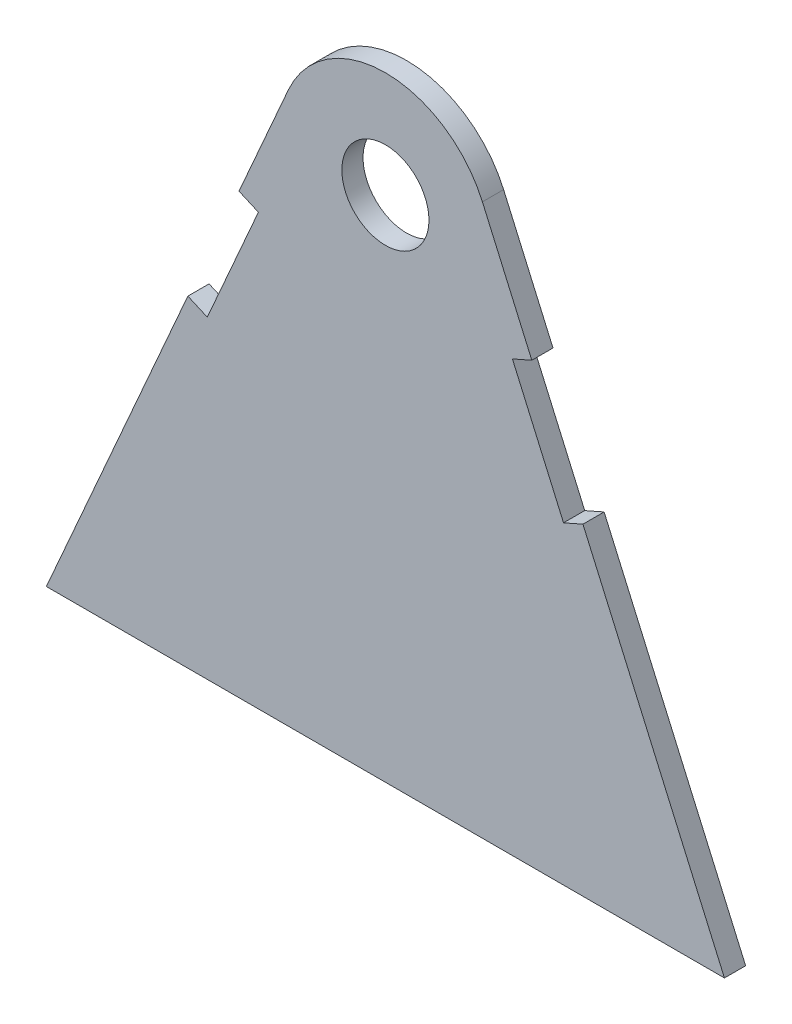
ISO-10303-21;
HEADER;
FILE_DESCRIPTION(('STEP AP214'),'2;1');
FILE_NAME('part.step','',(''),(''),'','','');
FILE_SCHEMA(('AUTOMOTIVE_DESIGN { 1 0 10303 214 1 1 1 1 }'));
ENDSEC;
DATA;
#1=APPLICATION_CONTEXT('core data for automotive mechanical design processes');
#2=APPLICATION_PROTOCOL_DEFINITION('international standard','automotive_design',2000,#1);
#3=PRODUCT_CONTEXT('',#1,'mechanical');
#4=PRODUCT('Part','Part','',(#3));
#5=PRODUCT_RELATED_PRODUCT_CATEGORY('part','',(#4));
#6=PRODUCT_DEFINITION_FORMATION('','',#4);
#7=PRODUCT_DEFINITION_CONTEXT('part definition',#1,'design');
#8=PRODUCT_DEFINITION('design','',#6,#7);
#9=PRODUCT_DEFINITION_SHAPE('','',#8);
#10=(LENGTH_UNIT() NAMED_UNIT(*) SI_UNIT(.MILLI.,.METRE.));
#11=(NAMED_UNIT(*) PLANE_ANGLE_UNIT() SI_UNIT($,.RADIAN.));
#12=(NAMED_UNIT(*) SI_UNIT($,.STERADIAN.) SOLID_ANGLE_UNIT());
#13=UNCERTAINTY_MEASURE_WITH_UNIT(LENGTH_MEASURE(1.E-05),#10,'distance_accuracy_value','');
#14=(GEOMETRIC_REPRESENTATION_CONTEXT(3) GLOBAL_UNCERTAINTY_ASSIGNED_CONTEXT((#13)) GLOBAL_UNIT_ASSIGNED_CONTEXT((#10,
#11,#12)) REPRESENTATION_CONTEXT('',''));
#15=CARTESIAN_POINT('',(0.,0.,0.));
#16=DIRECTION('',(0.,0.,1.));
#17=DIRECTION('',(1.,0.,0.));
#18=AXIS2_PLACEMENT_3D('',#15,#16,#17);
#19=CARTESIAN_POINT('',(0.,0.,1.5875));
#20=DIRECTION('',(0.,0.,-1.));
#21=DIRECTION('',(-1.,0.,0.));
#22=AXIS2_PLACEMENT_3D('',#19,#20,#21);
#23=CYLINDRICAL_SURFACE('',#22,7.9375);
#24=CARTESIAN_POINT('',(0.,0.,0.));
#25=DIRECTION('',(0.,0.,1.));
#26=DIRECTION('',(1.,0.,0.));
#27=AXIS2_PLACEMENT_3D('',#24,#25,#26);
#28=CIRCLE('',#27,7.9375);
#29=CARTESIAN_POINT('',(-7.26763882574666,3.19144671716444,0.));
#30=VERTEX_POINT('',#29);
#31=CARTESIAN_POINT('',(7.26763882574666,3.19144671716444,0.));
#32=VERTEX_POINT('',#31);
#33=EDGE_CURVE('E155',#30,#32,#28,.F.);
#34=ORIENTED_EDGE('',*,*,#33,.F.);
#35=DIRECTION('',(0.,0.,-1.));
#36=VECTOR('',#35,1.);
#37=CARTESIAN_POINT('',(-7.26763882574666,3.19144671716444,1.5875));
#38=LINE('',#37,#36);
#39=CARTESIAN_POINT('',(-7.26763882574666,3.19144671716444,1.5875));
#40=VERTEX_POINT('',#39);
#41=EDGE_CURVE('E11',#40,#30,#38,.T.);
#42=ORIENTED_EDGE('',*,*,#41,.F.);
#43=CARTESIAN_POINT('',(0.,0.,1.5875));
#44=DIRECTION('',(0.,0.,1.));
#45=DIRECTION('',(1.,0.,0.));
#46=AXIS2_PLACEMENT_3D('',#43,#44,#45);
#47=CIRCLE('',#46,7.9375);
#48=CARTESIAN_POINT('',(7.26763882574666,3.19144671716444,1.5875));
#49=VERTEX_POINT('',#48);
#50=EDGE_CURVE('E238',#40,#49,#47,.F.);
#51=ORIENTED_EDGE('',*,*,#50,.T.);
#52=DIRECTION('',(0.,0.,-1.));
#53=VECTOR('',#52,1.);
#54=CARTESIAN_POINT('',(7.26763882574666,3.19144671716444,1.5875));
#55=LINE('',#54,#53);
#56=EDGE_CURVE('E99',#49,#32,#55,.T.);
#57=ORIENTED_EDGE('',*,*,#56,.T.);
#58=EDGE_LOOP('',(#34,#42,#51,#57));
#59=FACE_BOUND('',#58,.T.);
#60=ADVANCED_FACE('F37',(#59),#23,.T.);
#61=CARTESIAN_POINT('',(-7.26763882574666,3.19144671716444,1.5875));
#62=DIRECTION('',(0.915608041038949,-0.4020720273593,0.));
#63=DIRECTION('',(0.4020720273593,0.91560804103895,0.));
#64=AXIS2_PLACEMENT_3D('',#61,#62,#63);
#65=PLANE('',#64);
#66=DIRECTION('',(-0.4020720273593,-0.91560804103895,0.));
#67=VECTOR('',#66,1.);
#68=CARTESIAN_POINT('',(-7.26763882574666,3.19144671716444,0.));
#69=LINE('',#68,#67);
#70=CARTESIAN_POINT('',(-10.9684254719667,-5.23607318195205,0.));
#71=VERTEX_POINT('',#70);
#72=EDGE_CURVE('E158',#30,#71,#69,.T.);
#73=ORIENTED_EDGE('',*,*,#72,.T.);
#74=DIRECTION('',(0.,0.,-1.));
#75=VECTOR('',#74,1.);
#76=CARTESIAN_POINT('',(-10.9684254719667,-5.23607318195205,1.5875));
#77=LINE('',#76,#75);
#78=CARTESIAN_POINT('',(-10.9684254719667,-5.23607318195205,1.5875));
#79=VERTEX_POINT('',#78);
#80=EDGE_CURVE('E45',#79,#71,#77,.T.);
#81=ORIENTED_EDGE('',*,*,#80,.F.);
#82=DIRECTION('',(-0.4020720273593,-0.91560804103895,0.));
#83=VECTOR('',#82,1.);
#84=CARTESIAN_POINT('',(-7.26763882574666,3.19144671716444,1.5875));
#85=LINE('',#84,#83);
#86=EDGE_CURVE('E239',#40,#79,#85,.T.);
#87=ORIENTED_EDGE('',*,*,#86,.F.);
#88=ORIENTED_EDGE('',*,*,#41,.T.);
#89=EDGE_LOOP('',(#73,#81,#87,#88));
#90=FACE_BOUND('',#89,.T.);
#91=ADVANCED_FACE('F244',(#90),#65,.F.);
#92=CARTESIAN_POINT('',(-3.70078664622001,-8.42751989911649,1.5875));
#93=DIRECTION('',(0.4020720273593,0.915608041038949,0.));
#94=DIRECTION('',(-0.915608041038949,0.4020720273593,0.));
#95=AXIS2_PLACEMENT_3D('',#92,#93,#94);
#96=PLANE('',#95);
#97=DIRECTION('',(0.915608041038949,-0.4020720273593,0.));
#98=VECTOR('',#97,1.);
#99=CARTESIAN_POINT('',(-3.70078664622001,-8.42751989911649,0.));
#100=LINE('',#99,#98);
#101=CARTESIAN_POINT('',(-9.51489770681733,-5.87436252538494,0.));
#102=VERTEX_POINT('',#101);
#103=EDGE_CURVE('E161',#71,#102,#100,.T.);
#104=ORIENTED_EDGE('',*,*,#103,.T.);
#105=DIRECTION('',(0.,0.,-1.));
#106=VECTOR('',#105,1.);
#107=CARTESIAN_POINT('',(-9.51489770681733,-5.87436252538494,1.5875));
#108=LINE('',#107,#106);
#109=CARTESIAN_POINT('',(-9.51489770681733,-5.87436252538494,1.5875));
#110=VERTEX_POINT('',#109);
#111=EDGE_CURVE('E198',#110,#102,#108,.T.);
#112=ORIENTED_EDGE('',*,*,#111,.F.);
#113=DIRECTION('',(0.915608041038949,-0.4020720273593,0.));
#114=VECTOR('',#113,1.);
#115=CARTESIAN_POINT('',(-3.70078664622001,-8.42751989911649,1.5875));
#116=LINE('',#115,#114);
#117=EDGE_CURVE('E207',#79,#110,#116,.T.);
#118=ORIENTED_EDGE('',*,*,#117,.F.);
#119=ORIENTED_EDGE('',*,*,#80,.T.);
#120=EDGE_LOOP('',(#104,#112,#118,#119));
#121=FACE_BOUND('',#120,.T.);
#122=ADVANCED_FACE('F205',(#121),#96,.F.);
#123=CARTESIAN_POINT('',(-5.81411106059732,2.55315737373155,1.5875));
#124=DIRECTION('',(0.91560804103895,-0.402072027359299,0.));
#125=DIRECTION('',(0.402072027359299,0.91560804103895,0.));
#126=AXIS2_PLACEMENT_3D('',#123,#124,#125);
#127=PLANE('',#126);
#128=DIRECTION('',(-0.402072027359299,-0.91560804103895,0.));
#129=VECTOR('',#128,1.);
#130=CARTESIAN_POINT('',(-5.81411106059732,2.55315737373155,0.));
#131=LINE('',#130,#129);
#132=CARTESIAN_POINT('',(-13.3446337674147,-14.5955291162809,0.));
#133=VERTEX_POINT('',#132);
#134=EDGE_CURVE('E163',#102,#133,#131,.T.);
#135=ORIENTED_EDGE('',*,*,#134,.T.);
#136=DIRECTION('',(0.,0.,-1.));
#137=VECTOR('',#136,1.);
#138=CARTESIAN_POINT('',(-13.3446337674147,-14.5955291162809,1.5875));
#139=LINE('',#138,#137);
#140=CARTESIAN_POINT('',(-13.3446337674147,-14.5955291162809,1.5875));
#141=VERTEX_POINT('',#140);
#142=EDGE_CURVE('E195',#141,#133,#139,.T.);
#143=ORIENTED_EDGE('',*,*,#142,.F.);
#144=DIRECTION('',(-0.402072027359299,-0.91560804103895,0.));
#145=VECTOR('',#144,1.);
#146=CARTESIAN_POINT('',(-5.81411106059732,2.55315737373155,1.5875));
#147=LINE('',#146,#145);
#148=EDGE_CURVE('E226',#110,#141,#147,.T.);
#149=ORIENTED_EDGE('',*,*,#148,.F.);
#150=ORIENTED_EDGE('',*,*,#111,.T.);
#151=EDGE_LOOP('',(#135,#143,#149,#150));
#152=FACE_BOUND('',#151,.T.);
#153=ADVANCED_FACE('F217',(#152),#127,.F.);
#154=CARTESIAN_POINT('',(-7.53052270681734,-17.1486864900125,1.5875));
#155=DIRECTION('',(-0.4020720273593,-0.915608041038949,0.));
#156=DIRECTION('',(0.91560804103895,-0.4020720273593,0.));
#157=AXIS2_PLACEMENT_3D('',#154,#155,#156);
#158=PLANE('',#157);
#159=DIRECTION('',(-0.91560804103895,0.4020720273593,0.));
#160=VECTOR('',#159,1.);
#161=CARTESIAN_POINT('',(-7.53052270681734,-17.1486864900125,0.));
#162=LINE('',#161,#160);
#163=CARTESIAN_POINT('',(-14.798161532564,-13.957239772848,0.));
#164=VERTEX_POINT('',#163);
#165=EDGE_CURVE('E165',#133,#164,#162,.T.);
#166=ORIENTED_EDGE('',*,*,#165,.T.);
#167=DIRECTION('',(0.,0.,-1.));
#168=VECTOR('',#167,1.);
#169=CARTESIAN_POINT('',(-14.798161532564,-13.957239772848,1.5875));
#170=LINE('',#169,#168);
#171=CARTESIAN_POINT('',(-14.798161532564,-13.957239772848,1.5875));
#172=VERTEX_POINT('',#171);
#173=EDGE_CURVE('E192',#172,#164,#170,.T.);
#174=ORIENTED_EDGE('',*,*,#173,.F.);
#175=DIRECTION('',(-0.91560804103895,0.4020720273593,0.));
#176=VECTOR('',#175,1.);
#177=CARTESIAN_POINT('',(-7.53052270681734,-17.1486864900125,1.5875));
#178=LINE('',#177,#176);
#179=EDGE_CURVE('E223',#141,#172,#178,.T.);
#180=ORIENTED_EDGE('',*,*,#179,.F.);
#181=ORIENTED_EDGE('',*,*,#142,.T.);
#182=EDGE_LOOP('',(#166,#174,#180,#181));
#183=FACE_BOUND('',#182,.T.);
#184=ADVANCED_FACE('F221',(#183),#158,.F.);
#185=CARTESIAN_POINT('',(-7.26763882574666,3.19144671716444,1.5875));
#186=DIRECTION('',(0.915608041038949,-0.4020720273593,0.));
#187=DIRECTION('',(0.4020720273593,0.91560804103895,0.));
#188=AXIS2_PLACEMENT_3D('',#185,#186,#187);
#189=PLANE('',#188);
#190=DIRECTION('',(-0.4020720273593,-0.91560804103895,0.));
#191=VECTOR('',#190,1.);
#192=CARTESIAN_POINT('',(-7.26763882574666,3.19144671716444,0.));
#193=LINE('',#192,#191);
#194=CARTESIAN_POINT('',(-25.4,-38.1,0.));
#195=VERTEX_POINT('',#194);
#196=EDGE_CURVE('E167',#164,#195,#193,.T.);
#197=ORIENTED_EDGE('',*,*,#196,.T.);
#198=DIRECTION('',(0.,0.,-1.));
#199=VECTOR('',#198,1.);
#200=CARTESIAN_POINT('',(-25.4,-38.1,1.5875));
#201=LINE('',#200,#199);
#202=CARTESIAN_POINT('',(-25.4,-38.1,1.5875));
#203=VERTEX_POINT('',#202);
#204=EDGE_CURVE('E189',#203,#195,#201,.T.);
#205=ORIENTED_EDGE('',*,*,#204,.F.);
#206=DIRECTION('',(-0.4020720273593,-0.91560804103895,0.));
#207=VECTOR('',#206,1.);
#208=CARTESIAN_POINT('',(-7.26763882574666,3.19144671716444,1.5875));
#209=LINE('',#208,#207);
#210=EDGE_CURVE('E225',#172,#203,#209,.T.);
#211=ORIENTED_EDGE('',*,*,#210,.F.);
#212=ORIENTED_EDGE('',*,*,#173,.T.);
#213=EDGE_LOOP('',(#197,#205,#211,#212));
#214=FACE_BOUND('',#213,.T.);
#215=ADVANCED_FACE('F256',(#214),#189,.F.);
#216=CARTESIAN_POINT('',(0.,-38.1,1.5875));
#217=DIRECTION('',(0.,1.,0.));
#218=DIRECTION('',(0.,0.,1.));
#219=AXIS2_PLACEMENT_3D('',#216,#217,#218);
#220=PLANE('',#219);
#221=DIRECTION('',(1.,0.,0.));
#222=VECTOR('',#221,1.);
#223=CARTESIAN_POINT('',(0.,-38.1,0.));
#224=LINE('',#223,#222);
#225=CARTESIAN_POINT('',(25.4,-38.1,0.));
#226=VERTEX_POINT('',#225);
#227=EDGE_CURVE('E169',#195,#226,#224,.T.);
#228=ORIENTED_EDGE('',*,*,#227,.T.);
#229=DIRECTION('',(0.,0.,-1.));
#230=VECTOR('',#229,1.);
#231=CARTESIAN_POINT('',(25.4,-38.1,1.5875));
#232=LINE('',#231,#230);
#233=CARTESIAN_POINT('',(25.4,-38.1,1.5875));
#234=VERTEX_POINT('',#233);
#235=EDGE_CURVE('E186',#234,#226,#232,.T.);
#236=ORIENTED_EDGE('',*,*,#235,.F.);
#237=DIRECTION('',(1.,0.,0.));
#238=VECTOR('',#237,1.);
#239=CARTESIAN_POINT('',(0.,-38.1,1.5875));
#240=LINE('',#239,#238);
#241=EDGE_CURVE('E228',#203,#234,#240,.T.);
#242=ORIENTED_EDGE('',*,*,#241,.F.);
#243=ORIENTED_EDGE('',*,*,#204,.T.);
#244=EDGE_LOOP('',(#228,#236,#242,#243));
#245=FACE_BOUND('',#244,.T.);
#246=ADVANCED_FACE('F259',(#245),#220,.F.);
#247=CARTESIAN_POINT('',(7.26763882574666,3.19144671716444,1.5875));
#248=DIRECTION('',(-0.915608041038949,-0.4020720273593,0.));
#249=DIRECTION('',(0.4020720273593,-0.91560804103895,0.));
#250=AXIS2_PLACEMENT_3D('',#247,#248,#249);
#251=PLANE('',#250);
#252=DIRECTION('',(-0.4020720273593,0.91560804103895,0.));
#253=VECTOR('',#252,1.);
#254=CARTESIAN_POINT('',(7.26763882574666,3.19144671716444,0.));
#255=LINE('',#254,#253);
#256=CARTESIAN_POINT('',(14.798161532564,-13.957239772848,0.));
#257=VERTEX_POINT('',#256);
#258=EDGE_CURVE('E171',#226,#257,#255,.T.);
#259=ORIENTED_EDGE('',*,*,#258,.T.);
#260=DIRECTION('',(0.,0.,-1.));
#261=VECTOR('',#260,1.);
#262=CARTESIAN_POINT('',(14.798161532564,-13.957239772848,1.5875));
#263=LINE('',#262,#261);
#264=CARTESIAN_POINT('',(14.798161532564,-13.957239772848,1.5875));
#265=VERTEX_POINT('',#264);
#266=EDGE_CURVE('E184',#265,#257,#263,.T.);
#267=ORIENTED_EDGE('',*,*,#266,.F.);
#268=DIRECTION('',(-0.4020720273593,0.91560804103895,0.));
#269=VECTOR('',#268,1.);
#270=CARTESIAN_POINT('',(7.26763882574666,3.19144671716444,1.5875));
#271=LINE('',#270,#269);
#272=EDGE_CURVE('E152',#234,#265,#271,.T.);
#273=ORIENTED_EDGE('',*,*,#272,.F.);
#274=ORIENTED_EDGE('',*,*,#235,.T.);
#275=EDGE_LOOP('',(#259,#267,#273,#274));
#276=FACE_BOUND('',#275,.T.);
#277=ADVANCED_FACE('F263',(#276),#251,.F.);
#278=CARTESIAN_POINT('',(7.5305227068173,-17.1486864900125,1.5875));
#279=DIRECTION('',(-0.402072027359298,0.91560804103895,0.));
#280=DIRECTION('',(-0.91560804103895,-0.402072027359298,0.));
#281=AXIS2_PLACEMENT_3D('',#278,#279,#280);
#282=PLANE('',#281);
#283=DIRECTION('',(0.91560804103895,0.402072027359298,0.));
#284=VECTOR('',#283,1.);
#285=CARTESIAN_POINT('',(7.5305227068173,-17.1486864900125,0.));
#286=LINE('',#285,#284);
#287=CARTESIAN_POINT('',(13.3446337674147,-14.5955291162809,0.));
#288=VERTEX_POINT('',#287);
#289=EDGE_CURVE('E174',#288,#257,#286,.T.);
#290=ORIENTED_EDGE('',*,*,#289,.F.);
#291=DIRECTION('',(0.,0.,-1.));
#292=VECTOR('',#291,1.);
#293=CARTESIAN_POINT('',(13.3446337674147,-14.5955291162809,1.5875));
#294=LINE('',#293,#292);
#295=CARTESIAN_POINT('',(13.3446337674147,-14.5955291162809,1.5875));
#296=VERTEX_POINT('',#295);
#297=EDGE_CURVE('E141',#296,#288,#294,.T.);
#298=ORIENTED_EDGE('',*,*,#297,.F.);
#299=DIRECTION('',(0.91560804103895,0.402072027359298,0.));
#300=VECTOR('',#299,1.);
#301=CARTESIAN_POINT('',(7.5305227068173,-17.1486864900125,1.5875));
#302=LINE('',#301,#300);
#303=EDGE_CURVE('E147',#296,#265,#302,.T.);
#304=ORIENTED_EDGE('',*,*,#303,.T.);
#305=ORIENTED_EDGE('',*,*,#266,.T.);
#306=EDGE_LOOP('',(#290,#298,#304,#305));
#307=FACE_BOUND('',#306,.T.);
#308=ADVANCED_FACE('F235',(#307),#282,.T.);
#309=CARTESIAN_POINT('',(5.81411106059732,2.55315737373155,1.5875));
#310=DIRECTION('',(0.91560804103895,0.402072027359299,0.));
#311=DIRECTION('',(-0.402072027359299,0.91560804103895,0.));
#312=AXIS2_PLACEMENT_3D('',#309,#310,#311);
#313=PLANE('',#312);
#314=DIRECTION('',(0.402072027359299,-0.91560804103895,0.));
#315=VECTOR('',#314,1.);
#316=CARTESIAN_POINT('',(5.81411106059732,2.55315737373155,0.));
#317=LINE('',#316,#315);
#318=CARTESIAN_POINT('',(9.51489770681733,-5.87436252538494,0.));
#319=VERTEX_POINT('',#318);
#320=EDGE_CURVE('E136',#319,#288,#317,.T.);
#321=ORIENTED_EDGE('',*,*,#320,.F.);
#322=DIRECTION('',(0.,0.,-1.));
#323=VECTOR('',#322,1.);
#324=CARTESIAN_POINT('',(9.51489770681733,-5.87436252538494,1.5875));
#325=LINE('',#324,#323);
#326=CARTESIAN_POINT('',(9.51489770681733,-5.87436252538494,1.5875));
#327=VERTEX_POINT('',#326);
#328=EDGE_CURVE('E131',#327,#319,#325,.T.);
#329=ORIENTED_EDGE('',*,*,#328,.F.);
#330=DIRECTION('',(0.402072027359299,-0.91560804103895,0.));
#331=VECTOR('',#330,1.);
#332=CARTESIAN_POINT('',(5.81411106059732,2.55315737373155,1.5875));
#333=LINE('',#332,#331);
#334=EDGE_CURVE('E134',#327,#296,#333,.T.);
#335=ORIENTED_EDGE('',*,*,#334,.T.);
#336=ORIENTED_EDGE('',*,*,#297,.T.);
#337=EDGE_LOOP('',(#321,#329,#335,#336));
#338=FACE_BOUND('',#337,.T.);
#339=ADVANCED_FACE('F133',(#338),#313,.T.);
#340=CARTESIAN_POINT('',(3.70078664622001,-8.42751989911649,1.5875));
#341=DIRECTION('',(0.4020720273593,-0.915608041038949,0.));
#342=DIRECTION('',(0.915608041038949,0.4020720273593,0.));
#343=AXIS2_PLACEMENT_3D('',#340,#341,#342);
#344=PLANE('',#343);
#345=DIRECTION('',(-0.915608041038949,-0.4020720273593,0.));
#346=VECTOR('',#345,1.);
#347=CARTESIAN_POINT('',(3.70078664622001,-8.42751989911649,0.));
#348=LINE('',#347,#346);
#349=CARTESIAN_POINT('',(10.9684254719667,-5.23607318195205,0.));
#350=VERTEX_POINT('',#349);
#351=EDGE_CURVE('E179',#350,#319,#348,.T.);
#352=ORIENTED_EDGE('',*,*,#351,.F.);
#353=DIRECTION('',(0.,0.,-1.));
#354=VECTOR('',#353,1.);
#355=CARTESIAN_POINT('',(10.9684254719667,-5.23607318195205,1.5875));
#356=LINE('',#355,#354);
#357=CARTESIAN_POINT('',(10.9684254719667,-5.23607318195205,1.5875));
#358=VERTEX_POINT('',#357);
#359=EDGE_CURVE('E92',#358,#350,#356,.T.);
#360=ORIENTED_EDGE('',*,*,#359,.F.);
#361=DIRECTION('',(-0.915608041038949,-0.4020720273593,0.));
#362=VECTOR('',#361,1.);
#363=CARTESIAN_POINT('',(3.70078664622001,-8.42751989911649,1.5875));
#364=LINE('',#363,#362);
#365=EDGE_CURVE('E145',#358,#327,#364,.T.);
#366=ORIENTED_EDGE('',*,*,#365,.T.);
#367=ORIENTED_EDGE('',*,*,#328,.T.);
#368=EDGE_LOOP('',(#352,#360,#366,#367));
#369=FACE_BOUND('',#368,.T.);
#370=ADVANCED_FACE('F149',(#369),#344,.T.);
#371=EDGE_CURVE('E175',#350,#32,#255,.T.);
#372=ORIENTED_EDGE('',*,*,#371,.T.);
#373=ORIENTED_EDGE('',*,*,#56,.F.);
#374=EDGE_CURVE('E53',#358,#49,#271,.T.);
#375=ORIENTED_EDGE('',*,*,#374,.F.);
#376=ORIENTED_EDGE('',*,*,#359,.T.);
#377=EDGE_LOOP('',(#372,#373,#375,#376));
#378=FACE_BOUND('',#377,.T.);
#379=ADVANCED_FACE('F271',(#378),#251,.F.);
#380=CARTESIAN_POINT('',(0.,0.,1.5875));
#381=DIRECTION('',(0.,0.,1.));
#382=DIRECTION('',(1.,0.,0.));
#383=AXIS2_PLACEMENT_3D('',#380,#381,#382);
#384=PLANE('',#383);
#385=CARTESIAN_POINT('',(0.,0.,1.5875));
#386=DIRECTION('',(0.,0.,1.));
#387=DIRECTION('',(1.,0.,0.));
#388=AXIS2_PLACEMENT_3D('',#385,#386,#387);
#389=CIRCLE('',#388,3.26389999999999);
#390=CARTESIAN_POINT('',(3.26389999999999,0.,1.5875));
#391=VERTEX_POINT('',#390);
#392=EDGE_CURVE('E290',#391,#391,#389,.T.);
#393=ORIENTED_EDGE('',*,*,#392,.F.);
#394=EDGE_LOOP('',(#393));
#395=FACE_BOUND('',#394,.T.);
#396=ORIENTED_EDGE('',*,*,#50,.F.);
#397=ORIENTED_EDGE('',*,*,#86,.T.);
#398=ORIENTED_EDGE('',*,*,#117,.T.);
#399=ORIENTED_EDGE('',*,*,#148,.T.);
#400=ORIENTED_EDGE('',*,*,#179,.T.);
#401=ORIENTED_EDGE('',*,*,#210,.T.);
#402=ORIENTED_EDGE('',*,*,#241,.T.);
#403=ORIENTED_EDGE('',*,*,#272,.T.);
#404=ORIENTED_EDGE('',*,*,#303,.F.);
#405=ORIENTED_EDGE('',*,*,#334,.F.);
#406=ORIENTED_EDGE('',*,*,#365,.F.);
#407=ORIENTED_EDGE('',*,*,#374,.T.);
#408=EDGE_LOOP('',(#396,#397,#398,#399,#400,#401,#402,#403,#404,#405,#406,#407));
#409=FACE_BOUND('',#408,.T.);
#410=ADVANCED_FACE('F144',(#395,#409),#384,.T.);
#411=CARTESIAN_POINT('',(0.,0.,0.));
#412=DIRECTION('',(0.,0.,1.));
#413=DIRECTION('',(1.,0.,0.));
#414=AXIS2_PLACEMENT_3D('',#411,#412,#413);
#415=PLANE('',#414);
#416=CARTESIAN_POINT('',(0.,0.,0.));
#417=DIRECTION('',(0.,0.,1.));
#418=DIRECTION('',(1.,0.,0.));
#419=AXIS2_PLACEMENT_3D('',#416,#417,#418);
#420=CIRCLE('',#419,3.2639);
#421=CARTESIAN_POINT('',(3.2639,0.,0.));
#422=VERTEX_POINT('',#421);
#423=EDGE_CURVE('E159',#422,#422,#420,.T.);
#424=ORIENTED_EDGE('',*,*,#423,.T.);
#425=EDGE_LOOP('',(#424));
#426=FACE_BOUND('',#425,.T.);
#427=ORIENTED_EDGE('',*,*,#33,.T.);
#428=ORIENTED_EDGE('',*,*,#371,.F.);
#429=ORIENTED_EDGE('',*,*,#351,.T.);
#430=ORIENTED_EDGE('',*,*,#320,.T.);
#431=ORIENTED_EDGE('',*,*,#289,.T.);
#432=ORIENTED_EDGE('',*,*,#258,.F.);
#433=ORIENTED_EDGE('',*,*,#227,.F.);
#434=ORIENTED_EDGE('',*,*,#196,.F.);
#435=ORIENTED_EDGE('',*,*,#165,.F.);
#436=ORIENTED_EDGE('',*,*,#134,.F.);
#437=ORIENTED_EDGE('',*,*,#103,.F.);
#438=ORIENTED_EDGE('',*,*,#72,.F.);
#439=EDGE_LOOP('',(#427,#428,#429,#430,#431,#432,#433,#434,#435,#436,#437,#438));
#440=FACE_BOUND('',#439,.T.);
#441=ADVANCED_FACE('F212',(#426,#440),#415,.F.);
#442=CARTESIAN_POINT('',(0.,0.,1.5875));
#443=DIRECTION('',(0.,0.,1.));
#444=DIRECTION('',(1.,0.,0.));
#445=AXIS2_PLACEMENT_3D('',#442,#443,#444);
#446=CYLINDRICAL_SURFACE('',#445,3.26389999999999);
#447=ORIENTED_EDGE('',*,*,#423,.F.);
#448=EDGE_LOOP('',(#447));
#449=FACE_BOUND('',#448,.T.);
#450=ORIENTED_EDGE('',*,*,#392,.T.);
#451=EDGE_LOOP('',(#450));
#452=FACE_BOUND('',#451,.T.);
#453=ADVANCED_FACE('F276',(#449,#452),#446,.F.);
#454=CLOSED_SHELL('',(#60,#91,#122,#153,#184,#215,#246,#277,#308,#339,#370,#379,#410,#441,#453));
#455=MANIFOLD_SOLID_BREP('B2',#454);
#456=ADVANCED_BREP_SHAPE_REPRESENTATION('',(#18,#455),#14);
#457=SHAPE_DEFINITION_REPRESENTATION(#9,#456);
ENDSEC;
END-ISO-10303-21;
